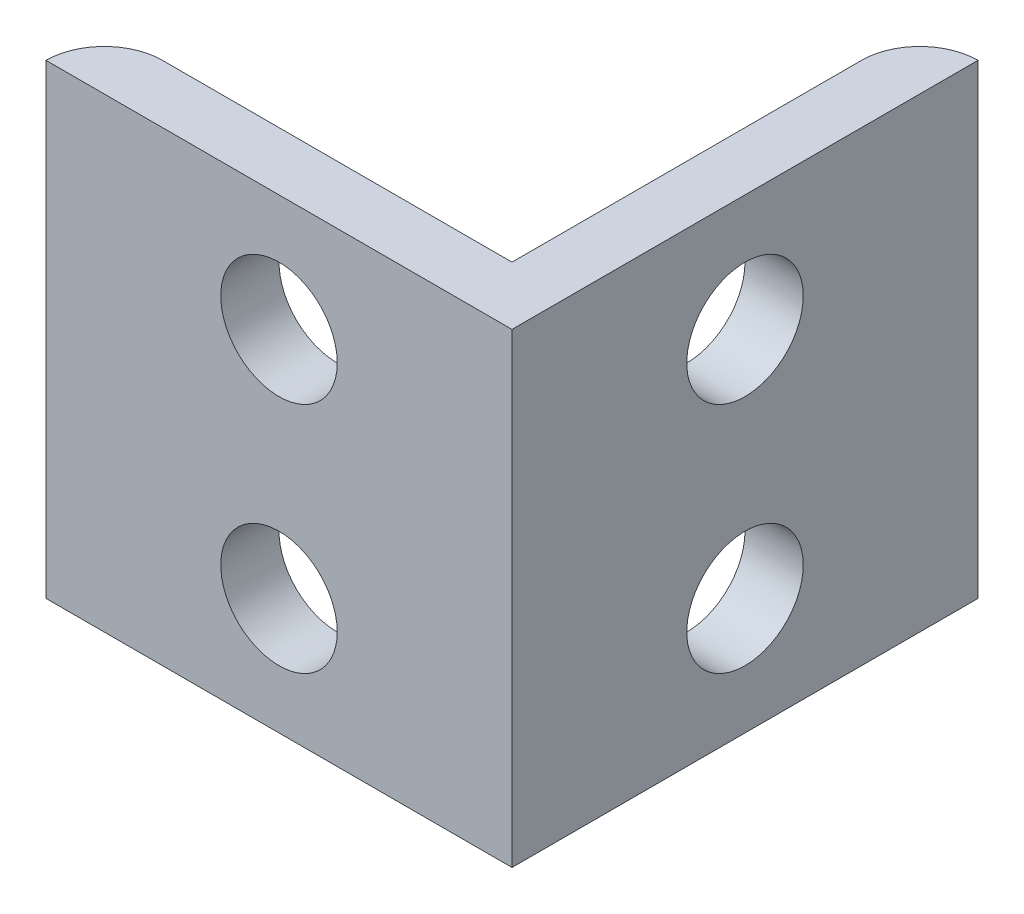
ISO-10303-21;
HEADER;
FILE_DESCRIPTION(('STEP AP214'),'2;1');
FILE_NAME('part.step','',(''),(''),'','','');
FILE_SCHEMA(('AUTOMOTIVE_DESIGN { 1 0 10303 214 1 1 1 1 }'));
ENDSEC;
DATA;
#1=APPLICATION_CONTEXT('core data for automotive mechanical design processes');
#2=APPLICATION_PROTOCOL_DEFINITION('international standard','automotive_design',2000,#1);
#3=PRODUCT_CONTEXT('',#1,'mechanical');
#4=PRODUCT('Part','Part','',(#3));
#5=PRODUCT_RELATED_PRODUCT_CATEGORY('part','',(#4));
#6=PRODUCT_DEFINITION_FORMATION('','',#4);
#7=PRODUCT_DEFINITION_CONTEXT('part definition',#1,'design');
#8=PRODUCT_DEFINITION('design','',#6,#7);
#9=PRODUCT_DEFINITION_SHAPE('','',#8);
#10=(LENGTH_UNIT() NAMED_UNIT(*) SI_UNIT(.MILLI.,.METRE.));
#11=(NAMED_UNIT(*) PLANE_ANGLE_UNIT() SI_UNIT($,.RADIAN.));
#12=(NAMED_UNIT(*) SI_UNIT($,.STERADIAN.) SOLID_ANGLE_UNIT());
#13=UNCERTAINTY_MEASURE_WITH_UNIT(LENGTH_MEASURE(1.E-05),#10,'distance_accuracy_value','');
#14=(GEOMETRIC_REPRESENTATION_CONTEXT(3) GLOBAL_UNCERTAINTY_ASSIGNED_CONTEXT((#13)) GLOBAL_UNIT_ASSIGNED_CONTEXT((#10,
#11,#12)) REPRESENTATION_CONTEXT('',''));
#15=CARTESIAN_POINT('',(0.,0.,0.));
#16=DIRECTION('',(0.,0.,1.));
#17=DIRECTION('',(1.,0.,0.));
#18=AXIS2_PLACEMENT_3D('',#15,#16,#17);
#19=CARTESIAN_POINT('',(3.175,25.4,-3.175));
#20=DIRECTION('',(0.,0.,1.));
#21=DIRECTION('',(-1.,0.,0.));
#22=AXIS2_PLACEMENT_3D('',#19,#20,#21);
#23=PLANE('',#22);
#24=CARTESIAN_POINT('',(12.7,6.35,-3.175));
#25=DIRECTION('',(0.,0.,1.));
#26=DIRECTION('',(1.,0.,0.));
#27=AXIS2_PLACEMENT_3D('',#24,#25,#26);
#28=CIRCLE('',#27,3.17499999999999);
#29=CARTESIAN_POINT('',(15.875,6.35,-3.175));
#30=VERTEX_POINT('',#29);
#31=EDGE_CURVE('E198',#30,#30,#28,.T.);
#32=ORIENTED_EDGE('',*,*,#31,.T.);
#33=EDGE_LOOP('',(#32));
#34=FACE_BOUND('',#33,.T.);
#35=DIRECTION('',(1.,0.,0.));
#36=VECTOR('',#35,1.);
#37=CARTESIAN_POINT('',(3.175,0.,-3.175));
#38=LINE('',#37,#36);
#39=CARTESIAN_POINT('',(3.175,0.,-3.175));
#40=VERTEX_POINT('',#39);
#41=CARTESIAN_POINT('',(22.225,0.,-3.175));
#42=VERTEX_POINT('',#41);
#43=EDGE_CURVE('E124',#40,#42,#38,.T.);
#44=ORIENTED_EDGE('',*,*,#43,.F.);
#45=DIRECTION('',(0.,-1.,0.));
#46=VECTOR('',#45,1.);
#47=CARTESIAN_POINT('',(3.175,25.4,-3.175));
#48=LINE('',#47,#46);
#49=CARTESIAN_POINT('',(3.175,25.4,-3.175));
#50=VERTEX_POINT('',#49);
#51=EDGE_CURVE('E11',#50,#40,#48,.T.);
#52=ORIENTED_EDGE('',*,*,#51,.F.);
#53=DIRECTION('',(1.,0.,0.));
#54=VECTOR('',#53,1.);
#55=CARTESIAN_POINT('',(3.175,25.4,-3.175));
#56=LINE('',#55,#54);
#57=CARTESIAN_POINT('',(22.225,25.4,-3.175));
#58=VERTEX_POINT('',#57);
#59=EDGE_CURVE('E116',#50,#58,#56,.T.);
#60=ORIENTED_EDGE('',*,*,#59,.T.);
#61=DIRECTION('',(0.,-1.,0.));
#62=VECTOR('',#61,1.);
#63=CARTESIAN_POINT('',(22.225,25.4,-3.175));
#64=LINE('',#63,#62);
#65=EDGE_CURVE('E46',#58,#42,#64,.T.);
#66=ORIENTED_EDGE('',*,*,#65,.T.);
#67=EDGE_LOOP('',(#44,#52,#60,#66));
#68=FACE_BOUND('',#67,.T.);
#69=CARTESIAN_POINT('',(12.7,19.05,-3.175));
#70=DIRECTION('',(0.,0.,1.));
#71=DIRECTION('',(1.,0.,0.));
#72=AXIS2_PLACEMENT_3D('',#69,#70,#71);
#73=CIRCLE('',#72,3.17499999999999);
#74=CARTESIAN_POINT('',(15.875,19.05,-3.175));
#75=VERTEX_POINT('',#74);
#76=EDGE_CURVE('E196',#75,#75,#73,.T.);
#77=ORIENTED_EDGE('',*,*,#76,.T.);
#78=EDGE_LOOP('',(#77));
#79=FACE_BOUND('',#78,.T.);
#80=ADVANCED_FACE('F37',(#34,#68,#79),#23,.F.);
#81=CARTESIAN_POINT('',(22.225,25.4,-3.175));
#82=DIRECTION('',(1.,0.,0.));
#83=DIRECTION('',(0.,0.,1.));
#84=AXIS2_PLACEMENT_3D('',#81,#82,#83);
#85=PLANE('',#84);
#86=CARTESIAN_POINT('',(22.225,6.35,-12.7));
#87=DIRECTION('',(1.,0.,0.));
#88=DIRECTION('',(0.,0.,-1.));
#89=AXIS2_PLACEMENT_3D('',#86,#87,#88);
#90=CIRCLE('',#89,3.17499999999999);
#91=CARTESIAN_POINT('',(22.225,6.35,-15.875));
#92=VERTEX_POINT('',#91);
#93=EDGE_CURVE('E211',#92,#92,#90,.T.);
#94=ORIENTED_EDGE('',*,*,#93,.T.);
#95=EDGE_LOOP('',(#94));
#96=FACE_BOUND('',#95,.T.);
#97=DIRECTION('',(0.,0.,-1.));
#98=VECTOR('',#97,1.);
#99=CARTESIAN_POINT('',(22.225,0.,-3.175));
#100=LINE('',#99,#98);
#101=CARTESIAN_POINT('',(22.225,0.,-22.225));
#102=VERTEX_POINT('',#101);
#103=EDGE_CURVE('E128',#42,#102,#100,.T.);
#104=ORIENTED_EDGE('',*,*,#103,.F.);
#105=ORIENTED_EDGE('',*,*,#65,.F.);
#106=DIRECTION('',(0.,0.,-1.));
#107=VECTOR('',#106,1.);
#108=CARTESIAN_POINT('',(22.225,25.4,-3.175));
#109=LINE('',#108,#107);
#110=CARTESIAN_POINT('',(22.225,25.4,-22.225));
#111=VERTEX_POINT('',#110);
#112=EDGE_CURVE('E114',#58,#111,#109,.T.);
#113=ORIENTED_EDGE('',*,*,#112,.T.);
#114=DIRECTION('',(0.,-1.,0.));
#115=VECTOR('',#114,1.);
#116=CARTESIAN_POINT('',(22.225,25.4,-22.225));
#117=LINE('',#116,#115);
#118=EDGE_CURVE('E108',#111,#102,#117,.T.);
#119=ORIENTED_EDGE('',*,*,#118,.T.);
#120=EDGE_LOOP('',(#104,#105,#113,#119));
#121=FACE_BOUND('',#120,.T.);
#122=CARTESIAN_POINT('',(22.225,19.05,-12.7));
#123=DIRECTION('',(1.,0.,0.));
#124=DIRECTION('',(0.,0.,-1.));
#125=AXIS2_PLACEMENT_3D('',#122,#123,#124);
#126=CIRCLE('',#125,3.17499999999999);
#127=CARTESIAN_POINT('',(22.225,19.05,-15.875));
#128=VERTEX_POINT('',#127);
#129=EDGE_CURVE('E205',#128,#128,#126,.T.);
#130=ORIENTED_EDGE('',*,*,#129,.T.);
#131=EDGE_LOOP('',(#130));
#132=FACE_BOUND('',#131,.T.);
#133=ADVANCED_FACE('F148',(#96,#121,#132),#85,.F.);
#134=CARTESIAN_POINT('',(3.175,25.4,0.));
#135=DIRECTION('',(0.,-1.,0.));
#136=DIRECTION('',(0.,0.,1.));
#137=AXIS2_PLACEMENT_3D('',#134,#135,#136);
#138=CYLINDRICAL_SURFACE('',#137,3.175);
#139=CARTESIAN_POINT('',(3.175,0.,0.));
#140=DIRECTION('',(0.,-1.,0.));
#141=DIRECTION('',(0.,0.,-1.));
#142=AXIS2_PLACEMENT_3D('',#139,#140,#141);
#143=CIRCLE('',#142,3.175);
#144=CARTESIAN_POINT('',(0.,0.,0.));
#145=VERTEX_POINT('',#144);
#146=EDGE_CURVE('E122',#145,#40,#143,.T.);
#147=ORIENTED_EDGE('',*,*,#146,.F.);
#148=DIRECTION('',(0.,-1.,0.));
#149=VECTOR('',#148,1.);
#150=CARTESIAN_POINT('',(0.,25.4,0.));
#151=LINE('',#150,#149);
#152=CARTESIAN_POINT('',(0.,25.4,0.));
#153=VERTEX_POINT('',#152);
#154=EDGE_CURVE('E121',#153,#145,#151,.T.);
#155=ORIENTED_EDGE('',*,*,#154,.F.);
#156=CARTESIAN_POINT('',(3.175,25.4,0.));
#157=DIRECTION('',(0.,-1.,0.));
#158=DIRECTION('',(0.,0.,-1.));
#159=AXIS2_PLACEMENT_3D('',#156,#157,#158);
#160=CIRCLE('',#159,3.175);
#161=EDGE_CURVE('E84',#153,#50,#160,.T.);
#162=ORIENTED_EDGE('',*,*,#161,.T.);
#163=ORIENTED_EDGE('',*,*,#51,.T.);
#164=EDGE_LOOP('',(#147,#155,#162,#163));
#165=FACE_BOUND('',#164,.T.);
#166=ADVANCED_FACE('F39',(#165),#138,.T.);
#167=CARTESIAN_POINT('',(25.4,25.4,-22.225));
#168=DIRECTION('',(0.,-1.,0.));
#169=DIRECTION('',(0.,0.,1.));
#170=AXIS2_PLACEMENT_3D('',#167,#168,#169);
#171=CYLINDRICAL_SURFACE('',#170,3.175);
#172=CARTESIAN_POINT('',(25.4,0.,-22.225));
#173=DIRECTION('',(0.,-1.,0.));
#174=DIRECTION('',(0.,0.,1.));
#175=AXIS2_PLACEMENT_3D('',#172,#173,#174);
#176=CIRCLE('',#175,3.175);
#177=CARTESIAN_POINT('',(25.4,0.,-25.4));
#178=VERTEX_POINT('',#177);
#179=EDGE_CURVE('E131',#102,#178,#176,.T.);
#180=ORIENTED_EDGE('',*,*,#179,.F.);
#181=ORIENTED_EDGE('',*,*,#118,.F.);
#182=CARTESIAN_POINT('',(25.4,25.4,-22.225));
#183=DIRECTION('',(0.,-1.,0.));
#184=DIRECTION('',(0.,0.,1.));
#185=AXIS2_PLACEMENT_3D('',#182,#183,#184);
#186=CIRCLE('',#185,3.175);
#187=CARTESIAN_POINT('',(25.4,25.4,-25.4));
#188=VERTEX_POINT('',#187);
#189=EDGE_CURVE('E98',#111,#188,#186,.T.);
#190=ORIENTED_EDGE('',*,*,#189,.T.);
#191=DIRECTION('',(0.,-1.,0.));
#192=VECTOR('',#191,1.);
#193=CARTESIAN_POINT('',(25.4,25.4,-25.4));
#194=LINE('',#193,#192);
#195=EDGE_CURVE('E103',#188,#178,#194,.T.);
#196=ORIENTED_EDGE('',*,*,#195,.T.);
#197=EDGE_LOOP('',(#180,#181,#190,#196));
#198=FACE_BOUND('',#197,.T.);
#199=ADVANCED_FACE('F111',(#198),#171,.T.);
#200=CARTESIAN_POINT('',(25.4,25.4,0.));
#201=DIRECTION('',(-1.,0.,0.));
#202=DIRECTION('',(0.,0.,-1.));
#203=AXIS2_PLACEMENT_3D('',#200,#201,#202);
#204=PLANE('',#203);
#205=CARTESIAN_POINT('',(25.4,19.05,-12.7));
#206=DIRECTION('',(1.,0.,0.));
#207=DIRECTION('',(0.,0.,-1.));
#208=AXIS2_PLACEMENT_3D('',#205,#206,#207);
#209=CIRCLE('',#208,3.17499999999999);
#210=CARTESIAN_POINT('',(25.4,19.05,-15.875));
#211=VERTEX_POINT('',#210);
#212=EDGE_CURVE('E208',#211,#211,#209,.T.);
#213=ORIENTED_EDGE('',*,*,#212,.F.);
#214=EDGE_LOOP('',(#213));
#215=FACE_BOUND('',#214,.T.);
#216=CARTESIAN_POINT('',(25.4,6.35,-12.7));
#217=DIRECTION('',(1.,0.,0.));
#218=DIRECTION('',(0.,0.,-1.));
#219=AXIS2_PLACEMENT_3D('',#216,#217,#218);
#220=CIRCLE('',#219,3.17499999999999);
#221=CARTESIAN_POINT('',(25.4,6.35,-15.875));
#222=VERTEX_POINT('',#221);
#223=EDGE_CURVE('E125',#222,#222,#220,.T.);
#224=ORIENTED_EDGE('',*,*,#223,.F.);
#225=EDGE_LOOP('',(#224));
#226=FACE_BOUND('',#225,.T.);
#227=DIRECTION('',(0.,0.,1.));
#228=VECTOR('',#227,1.);
#229=CARTESIAN_POINT('',(25.4,0.,0.));
#230=LINE('',#229,#228);
#231=CARTESIAN_POINT('',(25.4,0.,0.));
#232=VERTEX_POINT('',#231);
#233=EDGE_CURVE('E105',#178,#232,#230,.T.);
#234=ORIENTED_EDGE('',*,*,#233,.F.);
#235=ORIENTED_EDGE('',*,*,#195,.F.);
#236=DIRECTION('',(0.,0.,1.));
#237=VECTOR('',#236,1.);
#238=CARTESIAN_POINT('',(25.4,25.4,0.));
#239=LINE('',#238,#237);
#240=CARTESIAN_POINT('',(25.4,25.4,0.));
#241=VERTEX_POINT('',#240);
#242=EDGE_CURVE('E94',#188,#241,#239,.T.);
#243=ORIENTED_EDGE('',*,*,#242,.T.);
#244=DIRECTION('',(0.,-1.,0.));
#245=VECTOR('',#244,1.);
#246=CARTESIAN_POINT('',(25.4,25.4,0.));
#247=LINE('',#246,#245);
#248=EDGE_CURVE('E109',#241,#232,#247,.T.);
#249=ORIENTED_EDGE('',*,*,#248,.T.);
#250=EDGE_LOOP('',(#234,#235,#243,#249));
#251=FACE_BOUND('',#250,.T.);
#252=ADVANCED_FACE('F104',(#215,#226,#251),#204,.F.);
#253=CARTESIAN_POINT('',(0.,25.4,0.));
#254=DIRECTION('',(0.,0.,-1.));
#255=DIRECTION('',(1.,0.,0.));
#256=AXIS2_PLACEMENT_3D('',#253,#254,#255);
#257=PLANE('',#256);
#258=CARTESIAN_POINT('',(12.7,19.05,0.));
#259=DIRECTION('',(0.,0.,1.));
#260=DIRECTION('',(1.,0.,0.));
#261=AXIS2_PLACEMENT_3D('',#258,#259,#260);
#262=CIRCLE('',#261,3.17499999999999);
#263=CARTESIAN_POINT('',(15.875,19.05,0.));
#264=VERTEX_POINT('',#263);
#265=EDGE_CURVE('E193',#264,#264,#262,.T.);
#266=ORIENTED_EDGE('',*,*,#265,.F.);
#267=EDGE_LOOP('',(#266));
#268=FACE_BOUND('',#267,.T.);
#269=CARTESIAN_POINT('',(12.7,6.35,0.));
#270=DIRECTION('',(0.,0.,1.));
#271=DIRECTION('',(1.,0.,0.));
#272=AXIS2_PLACEMENT_3D('',#269,#270,#271);
#273=CIRCLE('',#272,3.17499999999999);
#274=CARTESIAN_POINT('',(15.875,6.35,0.));
#275=VERTEX_POINT('',#274);
#276=EDGE_CURVE('E202',#275,#275,#273,.T.);
#277=ORIENTED_EDGE('',*,*,#276,.F.);
#278=EDGE_LOOP('',(#277));
#279=FACE_BOUND('',#278,.T.);
#280=DIRECTION('',(-1.,0.,0.));
#281=VECTOR('',#280,1.);
#282=CARTESIAN_POINT('',(0.,0.,0.));
#283=LINE('',#282,#281);
#284=EDGE_CURVE('E74',#232,#145,#283,.T.);
#285=ORIENTED_EDGE('',*,*,#284,.F.);
#286=ORIENTED_EDGE('',*,*,#248,.F.);
#287=DIRECTION('',(-1.,0.,0.));
#288=VECTOR('',#287,1.);
#289=CARTESIAN_POINT('',(0.,25.4,0.));
#290=LINE('',#289,#288);
#291=EDGE_CURVE('E54',#241,#153,#290,.T.);
#292=ORIENTED_EDGE('',*,*,#291,.T.);
#293=ORIENTED_EDGE('',*,*,#154,.T.);
#294=EDGE_LOOP('',(#285,#286,#292,#293));
#295=FACE_BOUND('',#294,.T.);
#296=ADVANCED_FACE('F164',(#268,#279,#295),#257,.F.);
#297=CARTESIAN_POINT('',(3.175,25.4,0.));
#298=DIRECTION('',(0.,1.,0.));
#299=DIRECTION('',(0.,0.,-1.));
#300=AXIS2_PLACEMENT_3D('',#297,#298,#299);
#301=PLANE('',#300);
#302=ORIENTED_EDGE('',*,*,#161,.F.);
#303=ORIENTED_EDGE('',*,*,#291,.F.);
#304=ORIENTED_EDGE('',*,*,#242,.F.);
#305=ORIENTED_EDGE('',*,*,#189,.F.);
#306=ORIENTED_EDGE('',*,*,#112,.F.);
#307=ORIENTED_EDGE('',*,*,#59,.F.);
#308=EDGE_LOOP('',(#302,#303,#304,#305,#306,#307));
#309=FACE_BOUND('',#308,.T.);
#310=ADVANCED_FACE('F96',(#309),#301,.T.);
#311=CARTESIAN_POINT('',(3.175,0.,0.));
#312=DIRECTION('',(0.,1.,0.));
#313=DIRECTION('',(0.,0.,-1.));
#314=AXIS2_PLACEMENT_3D('',#311,#312,#313);
#315=PLANE('',#314);
#316=ORIENTED_EDGE('',*,*,#146,.T.);
#317=ORIENTED_EDGE('',*,*,#43,.T.);
#318=ORIENTED_EDGE('',*,*,#103,.T.);
#319=ORIENTED_EDGE('',*,*,#179,.T.);
#320=ORIENTED_EDGE('',*,*,#233,.T.);
#321=ORIENTED_EDGE('',*,*,#284,.T.);
#322=EDGE_LOOP('',(#316,#317,#318,#319,#320,#321));
#323=FACE_BOUND('',#322,.T.);
#324=ADVANCED_FACE('F145',(#323),#315,.F.);
#325=CARTESIAN_POINT('',(22.225,6.35,-12.7));
#326=DIRECTION('',(-1.,0.,0.));
#327=DIRECTION('',(0.,0.,-1.));
#328=AXIS2_PLACEMENT_3D('',#325,#326,#327);
#329=CYLINDRICAL_SURFACE('',#328,3.17499999999999);
#330=ORIENTED_EDGE('',*,*,#223,.T.);
#331=EDGE_LOOP('',(#330));
#332=FACE_BOUND('',#331,.T.);
#333=ORIENTED_EDGE('',*,*,#93,.F.);
#334=EDGE_LOOP('',(#333));
#335=FACE_BOUND('',#334,.T.);
#336=ADVANCED_FACE('F171',(#332,#335),#329,.F.);
#337=CARTESIAN_POINT('',(22.225,19.05,-12.7));
#338=DIRECTION('',(-1.,0.,0.));
#339=DIRECTION('',(0.,0.,-1.));
#340=AXIS2_PLACEMENT_3D('',#337,#338,#339);
#341=CYLINDRICAL_SURFACE('',#340,3.17499999999999);
#342=ORIENTED_EDGE('',*,*,#212,.T.);
#343=EDGE_LOOP('',(#342));
#344=FACE_BOUND('',#343,.T.);
#345=ORIENTED_EDGE('',*,*,#129,.F.);
#346=EDGE_LOOP('',(#345));
#347=FACE_BOUND('',#346,.T.);
#348=ADVANCED_FACE('F176',(#344,#347),#341,.F.);
#349=CARTESIAN_POINT('',(12.7,6.35,-3.175));
#350=DIRECTION('',(0.,0.,-1.));
#351=DIRECTION('',(1.,0.,0.));
#352=AXIS2_PLACEMENT_3D('',#349,#350,#351);
#353=CYLINDRICAL_SURFACE('',#352,3.17499999999999);
#354=ORIENTED_EDGE('',*,*,#276,.T.);
#355=EDGE_LOOP('',(#354));
#356=FACE_BOUND('',#355,.T.);
#357=ORIENTED_EDGE('',*,*,#31,.F.);
#358=EDGE_LOOP('',(#357));
#359=FACE_BOUND('',#358,.T.);
#360=ADVANCED_FACE('F180',(#356,#359),#353,.F.);
#361=CARTESIAN_POINT('',(12.7,19.05,-3.175));
#362=DIRECTION('',(0.,0.,-1.));
#363=DIRECTION('',(1.,0.,0.));
#364=AXIS2_PLACEMENT_3D('',#361,#362,#363);
#365=CYLINDRICAL_SURFACE('',#364,3.17499999999999);
#366=ORIENTED_EDGE('',*,*,#265,.T.);
#367=EDGE_LOOP('',(#366));
#368=FACE_BOUND('',#367,.T.);
#369=ORIENTED_EDGE('',*,*,#76,.F.);
#370=EDGE_LOOP('',(#369));
#371=FACE_BOUND('',#370,.T.);
#372=ADVANCED_FACE('F184',(#368,#371),#365,.F.);
#373=CLOSED_SHELL('',(#80,#133,#166,#199,#252,#296,#310,#324,#336,#348,#360,#372));
#374=MANIFOLD_SOLID_BREP('B2',#373);
#375=ADVANCED_BREP_SHAPE_REPRESENTATION('',(#18,#374),#14);
#376=SHAPE_DEFINITION_REPRESENTATION(#9,#375);
ENDSEC;
END-ISO-10303-21;
